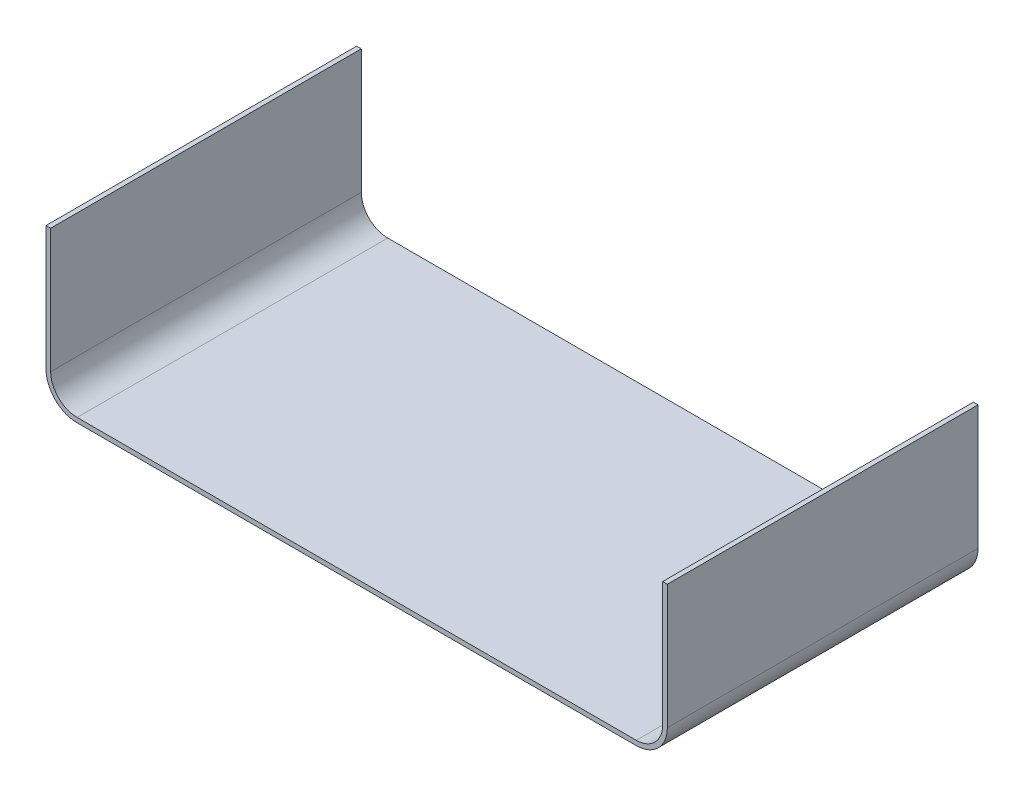
ISO-10303-21;
HEADER;
FILE_DESCRIPTION(('STEP AP214'),'2;1');
FILE_NAME('part.step','',(''),(''),'','','');
FILE_SCHEMA(('AUTOMOTIVE_DESIGN { 1 0 10303 214 1 1 1 1 }'));
ENDSEC;
DATA;
#1=APPLICATION_CONTEXT('core data for automotive mechanical design processes');
#2=APPLICATION_PROTOCOL_DEFINITION('international standard','automotive_design',2000,#1);
#3=PRODUCT_CONTEXT('',#1,'mechanical');
#4=PRODUCT('Part','Part','',(#3));
#5=PRODUCT_RELATED_PRODUCT_CATEGORY('part','',(#4));
#6=PRODUCT_DEFINITION_FORMATION('','',#4);
#7=PRODUCT_DEFINITION_CONTEXT('part definition',#1,'design');
#8=PRODUCT_DEFINITION('design','',#6,#7);
#9=PRODUCT_DEFINITION_SHAPE('','',#8);
#10=(LENGTH_UNIT() NAMED_UNIT(*) SI_UNIT(.MILLI.,.METRE.));
#11=(NAMED_UNIT(*) PLANE_ANGLE_UNIT() SI_UNIT($,.RADIAN.));
#12=(NAMED_UNIT(*) SI_UNIT($,.STERADIAN.) SOLID_ANGLE_UNIT());
#13=UNCERTAINTY_MEASURE_WITH_UNIT(LENGTH_MEASURE(1.E-05),#10,'distance_accuracy_value','');
#14=(GEOMETRIC_REPRESENTATION_CONTEXT(3) GLOBAL_UNCERTAINTY_ASSIGNED_CONTEXT((#13)) GLOBAL_UNIT_ASSIGNED_CONTEXT((#10,
#11,#12)) REPRESENTATION_CONTEXT('',''));
#15=CARTESIAN_POINT('',(0.,0.,0.));
#16=DIRECTION('',(0.,0.,1.));
#17=DIRECTION('',(1.,0.,0.));
#18=AXIS2_PLACEMENT_3D('',#15,#16,#17);
#19=CARTESIAN_POINT('',(-200.,100.,200.));
#20=DIRECTION('',(0.,-1.,0.));
#21=DIRECTION('',(0.,0.,-1.));
#22=AXIS2_PLACEMENT_3D('',#19,#20,#21);
#23=PLANE('',#22);
#24=DIRECTION('',(0.,0.,-1.));
#25=VECTOR('',#24,1.);
#26=CARTESIAN_POINT('',(197.,100.,200.));
#27=LINE('',#26,#25);
#28=CARTESIAN_POINT('',(197.,100.,200.));
#29=VERTEX_POINT('',#28);
#30=CARTESIAN_POINT('',(197.,100.,0.));
#31=VERTEX_POINT('',#30);
#32=EDGE_CURVE('E136',#29,#31,#27,.T.);
#33=ORIENTED_EDGE('',*,*,#32,.F.);
#34=DIRECTION('',(-1.,0.,0.));
#35=VECTOR('',#34,1.);
#36=CARTESIAN_POINT('',(-200.,100.,200.));
#37=LINE('',#36,#35);
#38=CARTESIAN_POINT('',(200.,100.,200.));
#39=VERTEX_POINT('',#38);
#40=EDGE_CURVE('E202',#39,#29,#37,.T.);
#41=ORIENTED_EDGE('',*,*,#40,.F.);
#42=DIRECTION('',(0.,0.,-1.));
#43=VECTOR('',#42,1.);
#44=CARTESIAN_POINT('',(200.,100.,200.));
#45=LINE('',#44,#43);
#46=CARTESIAN_POINT('',(200.,100.,0.));
#47=VERTEX_POINT('',#46);
#48=EDGE_CURVE('E157',#39,#47,#45,.T.);
#49=ORIENTED_EDGE('',*,*,#48,.T.);
#50=DIRECTION('',(-1.,0.,0.));
#51=VECTOR('',#50,1.);
#52=CARTESIAN_POINT('',(-200.,100.,0.));
#53=LINE('',#52,#51);
#54=EDGE_CURVE('E142',#47,#31,#53,.T.);
#55=ORIENTED_EDGE('',*,*,#54,.T.);
#56=EDGE_LOOP('',(#33,#41,#49,#55));
#57=FACE_BOUND('',#56,.T.);
#58=ADVANCED_FACE('F31',(#57),#23,.F.);
#59=CARTESIAN_POINT('',(-197.,100.,200.));
#60=VERTEX_POINT('',#59);
#61=CARTESIAN_POINT('',(-200.,100.,200.));
#62=VERTEX_POINT('',#61);
#63=EDGE_CURVE('E134',#60,#62,#37,.T.);
#64=ORIENTED_EDGE('',*,*,#63,.F.);
#65=DIRECTION('',(0.,0.,-1.));
#66=VECTOR('',#65,1.);
#67=CARTESIAN_POINT('',(-197.,100.,200.));
#68=LINE('',#67,#66);
#69=CARTESIAN_POINT('',(-197.,100.,0.));
#70=VERTEX_POINT('',#69);
#71=EDGE_CURVE('E121',#60,#70,#68,.T.);
#72=ORIENTED_EDGE('',*,*,#71,.T.);
#73=CARTESIAN_POINT('',(-200.,100.,0.));
#74=VERTEX_POINT('',#73);
#75=EDGE_CURVE('E132',#70,#74,#53,.T.);
#76=ORIENTED_EDGE('',*,*,#75,.T.);
#77=DIRECTION('',(0.,0.,-1.));
#78=VECTOR('',#77,1.);
#79=CARTESIAN_POINT('',(-200.,100.,200.));
#80=LINE('',#79,#78);
#81=EDGE_CURVE('E160',#62,#74,#80,.T.);
#82=ORIENTED_EDGE('',*,*,#81,.F.);
#83=EDGE_LOOP('',(#64,#72,#76,#82));
#84=FACE_BOUND('',#83,.T.);
#85=ADVANCED_FACE('F130',(#84),#23,.F.);
#86=CARTESIAN_POINT('',(-200.,100.,200.));
#87=DIRECTION('',(1.,0.,0.));
#88=DIRECTION('',(0.,1.,0.));
#89=AXIS2_PLACEMENT_3D('',#86,#87,#88);
#90=PLANE('',#89);
#91=DIRECTION('',(0.,-1.,0.));
#92=VECTOR('',#91,1.);
#93=CARTESIAN_POINT('',(-200.,100.,0.));
#94=LINE('',#93,#92);
#95=CARTESIAN_POINT('',(-200.,20.0000000000001,0.));
#96=VERTEX_POINT('',#95);
#97=EDGE_CURVE('E140',#74,#96,#94,.T.);
#98=ORIENTED_EDGE('',*,*,#97,.T.);
#99=DIRECTION('',(0.,0.,-1.));
#100=VECTOR('',#99,1.);
#101=CARTESIAN_POINT('',(-200.,20.0000000000001,200.));
#102=LINE('',#101,#100);
#103=CARTESIAN_POINT('',(-200.,20.0000000000001,200.));
#104=VERTEX_POINT('',#103);
#105=EDGE_CURVE('E11',#96,#104,#102,.F.);
#106=ORIENTED_EDGE('',*,*,#105,.T.);
#107=DIRECTION('',(0.,-1.,0.));
#108=VECTOR('',#107,1.);
#109=CARTESIAN_POINT('',(-200.,100.,200.));
#110=LINE('',#109,#108);
#111=EDGE_CURVE('E201',#62,#104,#110,.T.);
#112=ORIENTED_EDGE('',*,*,#111,.F.);
#113=ORIENTED_EDGE('',*,*,#81,.T.);
#114=EDGE_LOOP('',(#98,#106,#112,#113));
#115=FACE_BOUND('',#114,.T.);
#116=ADVANCED_FACE('F200',(#115),#90,.F.);
#117=CARTESIAN_POINT('',(-200.,0.,200.));
#118=DIRECTION('',(0.,1.,0.));
#119=DIRECTION('',(0.,0.,1.));
#120=AXIS2_PLACEMENT_3D('',#117,#118,#119);
#121=PLANE('',#120);
#122=DIRECTION('',(1.,0.,0.));
#123=VECTOR('',#122,1.);
#124=CARTESIAN_POINT('',(-200.,0.,0.));
#125=LINE('',#124,#123);
#126=CARTESIAN_POINT('',(-180.,0.,0.));
#127=VERTEX_POINT('',#126);
#128=CARTESIAN_POINT('',(180.,0.,0.));
#129=VERTEX_POINT('',#128);
#130=EDGE_CURVE('E152',#127,#129,#125,.T.);
#131=ORIENTED_EDGE('',*,*,#130,.T.);
#132=DIRECTION('',(0.,0.,-1.));
#133=VECTOR('',#132,1.);
#134=CARTESIAN_POINT('',(180.,0.,200.));
#135=LINE('',#134,#133);
#136=CARTESIAN_POINT('',(180.,0.,200.));
#137=VERTEX_POINT('',#136);
#138=EDGE_CURVE('E172',#129,#137,#135,.F.);
#139=ORIENTED_EDGE('',*,*,#138,.T.);
#140=DIRECTION('',(1.,0.,0.));
#141=VECTOR('',#140,1.);
#142=CARTESIAN_POINT('',(-200.,0.,200.));
#143=LINE('',#142,#141);
#144=CARTESIAN_POINT('',(-180.,0.,200.));
#145=VERTEX_POINT('',#144);
#146=EDGE_CURVE('E184',#145,#137,#143,.T.);
#147=ORIENTED_EDGE('',*,*,#146,.F.);
#148=DIRECTION('',(0.,0.,-1.));
#149=VECTOR('',#148,1.);
#150=CARTESIAN_POINT('',(-180.,0.,200.));
#151=LINE('',#150,#149);
#152=EDGE_CURVE('E169',#145,#127,#151,.T.);
#153=ORIENTED_EDGE('',*,*,#152,.T.);
#154=EDGE_LOOP('',(#131,#139,#147,#153));
#155=FACE_BOUND('',#154,.T.);
#156=ADVANCED_FACE('F196',(#155),#121,.F.);
#157=CARTESIAN_POINT('',(200.,0.,200.));
#158=DIRECTION('',(-1.,0.,0.));
#159=DIRECTION('',(0.,-1.,0.));
#160=AXIS2_PLACEMENT_3D('',#157,#158,#159);
#161=PLANE('',#160);
#162=DIRECTION('',(0.,1.,0.));
#163=VECTOR('',#162,1.);
#164=CARTESIAN_POINT('',(200.,0.,200.));
#165=LINE('',#164,#163);
#166=CARTESIAN_POINT('',(200.,20.0000000000001,200.));
#167=VERTEX_POINT('',#166);
#168=EDGE_CURVE('E149',#167,#39,#165,.T.);
#169=ORIENTED_EDGE('',*,*,#168,.F.);
#170=DIRECTION('',(0.,0.,-1.));
#171=VECTOR('',#170,1.);
#172=CARTESIAN_POINT('',(200.,20.0000000000001,200.));
#173=LINE('',#172,#171);
#174=CARTESIAN_POINT('',(200.,20.0000000000001,0.));
#175=VERTEX_POINT('',#174);
#176=EDGE_CURVE('E162',#167,#175,#173,.T.);
#177=ORIENTED_EDGE('',*,*,#176,.T.);
#178=DIRECTION('',(0.,1.,0.));
#179=VECTOR('',#178,1.);
#180=CARTESIAN_POINT('',(200.,0.,0.));
#181=LINE('',#180,#179);
#182=EDGE_CURVE('E155',#175,#47,#181,.T.);
#183=ORIENTED_EDGE('',*,*,#182,.T.);
#184=ORIENTED_EDGE('',*,*,#48,.F.);
#185=EDGE_LOOP('',(#169,#177,#183,#184));
#186=FACE_BOUND('',#185,.T.);
#187=ADVANCED_FACE('F189',(#186),#161,.F.);
#188=CARTESIAN_POINT('',(200.,100.,200.));
#189=DIRECTION('',(0.,0.,1.));
#190=DIRECTION('',(1.,0.,0.));
#191=AXIS2_PLACEMENT_3D('',#188,#189,#190);
#192=PLANE('',#191);
#193=DIRECTION('',(0.,1.,0.));
#194=VECTOR('',#193,1.);
#195=CARTESIAN_POINT('',(197.,0.,200.));
#196=LINE('',#195,#194);
#197=CARTESIAN_POINT('',(197.,20.0000000000001,200.));
#198=VERTEX_POINT('',#197);
#199=EDGE_CURVE('E218',#198,#29,#196,.T.);
#200=ORIENTED_EDGE('',*,*,#199,.F.);
#201=CARTESIAN_POINT('',(180.,20.,200.));
#202=DIRECTION('',(0.,0.,1.));
#203=DIRECTION('',(1.,0.,0.));
#204=AXIS2_PLACEMENT_3D('',#201,#202,#203);
#205=CIRCLE('',#204,17.);
#206=CARTESIAN_POINT('',(180.,3.,200.));
#207=VERTEX_POINT('',#206);
#208=EDGE_CURVE('E145',#207,#198,#205,.T.);
#209=ORIENTED_EDGE('',*,*,#208,.F.);
#210=DIRECTION('',(1.,0.,0.));
#211=VECTOR('',#210,1.);
#212=CARTESIAN_POINT('',(-200.,3.,200.));
#213=LINE('',#212,#211);
#214=CARTESIAN_POINT('',(-180.,3.,200.));
#215=VERTEX_POINT('',#214);
#216=EDGE_CURVE('E220',#215,#207,#213,.T.);
#217=ORIENTED_EDGE('',*,*,#216,.F.);
#218=CARTESIAN_POINT('',(-180.,20.,200.));
#219=DIRECTION('',(0.,0.,1.));
#220=DIRECTION('',(1.,0.,0.));
#221=AXIS2_PLACEMENT_3D('',#218,#219,#220);
#222=CIRCLE('',#221,17.);
#223=CARTESIAN_POINT('',(-197.,20.0000000000001,200.));
#224=VERTEX_POINT('',#223);
#225=EDGE_CURVE('E222',#224,#215,#222,.T.);
#226=ORIENTED_EDGE('',*,*,#225,.F.);
#227=DIRECTION('',(0.,-1.,0.));
#228=VECTOR('',#227,1.);
#229=CARTESIAN_POINT('',(-197.,100.,200.));
#230=LINE('',#229,#228);
#231=EDGE_CURVE('E216',#60,#224,#230,.T.);
#232=ORIENTED_EDGE('',*,*,#231,.F.);
#233=ORIENTED_EDGE('',*,*,#63,.T.);
#234=ORIENTED_EDGE('',*,*,#111,.T.);
#235=CARTESIAN_POINT('',(-180.,20.,200.));
#236=DIRECTION('',(0.,0.,1.));
#237=DIRECTION('',(1.,0.,0.));
#238=AXIS2_PLACEMENT_3D('',#235,#236,#237);
#239=CIRCLE('',#238,20.);
#240=EDGE_CURVE('E174',#104,#145,#239,.T.);
#241=ORIENTED_EDGE('',*,*,#240,.T.);
#242=ORIENTED_EDGE('',*,*,#146,.T.);
#243=CARTESIAN_POINT('',(180.,20.,200.));
#244=DIRECTION('',(0.,0.,1.));
#245=DIRECTION('',(1.,0.,0.));
#246=AXIS2_PLACEMENT_3D('',#243,#244,#245);
#247=CIRCLE('',#246,20.);
#248=EDGE_CURVE('E39',#137,#167,#247,.T.);
#249=ORIENTED_EDGE('',*,*,#248,.T.);
#250=ORIENTED_EDGE('',*,*,#168,.T.);
#251=ORIENTED_EDGE('',*,*,#40,.T.);
#252=EDGE_LOOP('',(#200,#209,#217,#226,#232,#233,#234,#241,#242,#249,#250,#251));
#253=FACE_BOUND('',#252,.T.);
#254=ADVANCED_FACE('F180',(#253),#192,.T.);
#255=CARTESIAN_POINT('',(200.,100.,0.));
#256=DIRECTION('',(0.,0.,1.));
#257=DIRECTION('',(1.,0.,0.));
#258=AXIS2_PLACEMENT_3D('',#255,#256,#257);
#259=PLANE('',#258);
#260=CARTESIAN_POINT('',(180.,20.,0.));
#261=DIRECTION('',(0.,0.,1.));
#262=DIRECTION('',(1.,0.,0.));
#263=AXIS2_PLACEMENT_3D('',#260,#261,#262);
#264=CIRCLE('',#263,17.);
#265=CARTESIAN_POINT('',(197.,20.0000000000001,0.));
#266=VERTEX_POINT('',#265);
#267=CARTESIAN_POINT('',(180.,3.,0.));
#268=VERTEX_POINT('',#267);
#269=EDGE_CURVE('E208',#266,#268,#264,.F.);
#270=ORIENTED_EDGE('',*,*,#269,.F.);
#271=DIRECTION('',(0.,1.,0.));
#272=VECTOR('',#271,1.);
#273=CARTESIAN_POINT('',(197.,0.,0.));
#274=LINE('',#273,#272);
#275=EDGE_CURVE('E211',#266,#31,#274,.T.);
#276=ORIENTED_EDGE('',*,*,#275,.T.);
#277=ORIENTED_EDGE('',*,*,#54,.F.);
#278=ORIENTED_EDGE('',*,*,#182,.F.);
#279=CARTESIAN_POINT('',(180.,20.,0.));
#280=DIRECTION('',(0.,0.,1.));
#281=DIRECTION('',(1.,0.,0.));
#282=AXIS2_PLACEMENT_3D('',#279,#280,#281);
#283=CIRCLE('',#282,20.);
#284=EDGE_CURVE('E167',#175,#129,#283,.F.);
#285=ORIENTED_EDGE('',*,*,#284,.T.);
#286=ORIENTED_EDGE('',*,*,#130,.F.);
#287=CARTESIAN_POINT('',(-180.,20.,0.));
#288=DIRECTION('',(0.,0.,1.));
#289=DIRECTION('',(1.,0.,0.));
#290=AXIS2_PLACEMENT_3D('',#287,#288,#289);
#291=CIRCLE('',#290,20.);
#292=EDGE_CURVE('E165',#127,#96,#291,.F.);
#293=ORIENTED_EDGE('',*,*,#292,.T.);
#294=ORIENTED_EDGE('',*,*,#97,.F.);
#295=ORIENTED_EDGE('',*,*,#75,.F.);
#296=DIRECTION('',(0.,-1.,0.));
#297=VECTOR('',#296,1.);
#298=CARTESIAN_POINT('',(-197.,100.,0.));
#299=LINE('',#298,#297);
#300=CARTESIAN_POINT('',(-197.,20.0000000000001,0.));
#301=VERTEX_POINT('',#300);
#302=EDGE_CURVE('E118',#70,#301,#299,.T.);
#303=ORIENTED_EDGE('',*,*,#302,.T.);
#304=CARTESIAN_POINT('',(-180.,20.,0.));
#305=DIRECTION('',(0.,0.,1.));
#306=DIRECTION('',(1.,0.,0.));
#307=AXIS2_PLACEMENT_3D('',#304,#305,#306);
#308=CIRCLE('',#307,17.);
#309=CARTESIAN_POINT('',(-180.,3.,0.));
#310=VERTEX_POINT('',#309);
#311=EDGE_CURVE('E206',#310,#301,#308,.F.);
#312=ORIENTED_EDGE('',*,*,#311,.F.);
#313=DIRECTION('',(1.,0.,0.));
#314=VECTOR('',#313,1.);
#315=CARTESIAN_POINT('',(-200.,3.,0.));
#316=LINE('',#315,#314);
#317=EDGE_CURVE('E126',#310,#268,#316,.T.);
#318=ORIENTED_EDGE('',*,*,#317,.T.);
#319=EDGE_LOOP('',(#270,#276,#277,#278,#285,#286,#293,#294,#295,#303,#312,#318));
#320=FACE_BOUND('',#319,.T.);
#321=ADVANCED_FACE('F139',(#320),#259,.F.);
#322=CARTESIAN_POINT('',(180.,20.,200.));
#323=DIRECTION('',(0.,0.,-1.));
#324=DIRECTION('',(-1.,0.,0.));
#325=AXIS2_PLACEMENT_3D('',#322,#323,#324);
#326=CYLINDRICAL_SURFACE('',#325,20.);
#327=ORIENTED_EDGE('',*,*,#248,.F.);
#328=ORIENTED_EDGE('',*,*,#138,.F.);
#329=ORIENTED_EDGE('',*,*,#284,.F.);
#330=ORIENTED_EDGE('',*,*,#176,.F.);
#331=EDGE_LOOP('',(#327,#328,#329,#330));
#332=FACE_BOUND('',#331,.T.);
#333=ADVANCED_FACE('F192',(#332),#326,.T.);
#334=CARTESIAN_POINT('',(-180.,20.,200.));
#335=DIRECTION('',(0.,0.,-1.));
#336=DIRECTION('',(-1.,0.,0.));
#337=AXIS2_PLACEMENT_3D('',#334,#335,#336);
#338=CYLINDRICAL_SURFACE('',#337,20.);
#339=ORIENTED_EDGE('',*,*,#240,.F.);
#340=ORIENTED_EDGE('',*,*,#105,.F.);
#341=ORIENTED_EDGE('',*,*,#292,.F.);
#342=ORIENTED_EDGE('',*,*,#152,.F.);
#343=EDGE_LOOP('',(#339,#340,#341,#342));
#344=FACE_BOUND('',#343,.T.);
#345=ADVANCED_FACE('F33',(#344),#338,.T.);
#346=CARTESIAN_POINT('',(-197.,100.,200.));
#347=DIRECTION('',(1.,0.,0.));
#348=DIRECTION('',(0.,1.,0.));
#349=AXIS2_PLACEMENT_3D('',#346,#347,#348);
#350=PLANE('',#349);
#351=ORIENTED_EDGE('',*,*,#302,.F.);
#352=ORIENTED_EDGE('',*,*,#71,.F.);
#353=ORIENTED_EDGE('',*,*,#231,.T.);
#354=DIRECTION('',(0.,0.,1.));
#355=VECTOR('',#354,1.);
#356=CARTESIAN_POINT('',(-197.,20.0000000000001,200.));
#357=LINE('',#356,#355);
#358=EDGE_CURVE('E46',#301,#224,#357,.T.);
#359=ORIENTED_EDGE('',*,*,#358,.F.);
#360=EDGE_LOOP('',(#351,#352,#353,#359));
#361=FACE_BOUND('',#360,.T.);
#362=ADVANCED_FACE('F120',(#361),#350,.T.);
#363=CARTESIAN_POINT('',(-200.,3.,200.));
#364=DIRECTION('',(0.,1.,0.));
#365=DIRECTION('',(0.,0.,1.));
#366=AXIS2_PLACEMENT_3D('',#363,#364,#365);
#367=PLANE('',#366);
#368=ORIENTED_EDGE('',*,*,#317,.F.);
#369=DIRECTION('',(0.,0.,1.));
#370=VECTOR('',#369,1.);
#371=CARTESIAN_POINT('',(-180.,3.,200.));
#372=LINE('',#371,#370);
#373=EDGE_CURVE('E213',#215,#310,#372,.F.);
#374=ORIENTED_EDGE('',*,*,#373,.F.);
#375=ORIENTED_EDGE('',*,*,#216,.T.);
#376=DIRECTION('',(0.,0.,1.));
#377=VECTOR('',#376,1.);
#378=CARTESIAN_POINT('',(180.,3.,200.));
#379=LINE('',#378,#377);
#380=EDGE_CURVE('E226',#268,#207,#379,.T.);
#381=ORIENTED_EDGE('',*,*,#380,.F.);
#382=EDGE_LOOP('',(#368,#374,#375,#381));
#383=FACE_BOUND('',#382,.T.);
#384=ADVANCED_FACE('F238',(#383),#367,.T.);
#385=CARTESIAN_POINT('',(197.,0.,200.));
#386=DIRECTION('',(-1.,0.,0.));
#387=DIRECTION('',(0.,-1.,0.));
#388=AXIS2_PLACEMENT_3D('',#385,#386,#387);
#389=PLANE('',#388);
#390=ORIENTED_EDGE('',*,*,#199,.T.);
#391=ORIENTED_EDGE('',*,*,#32,.T.);
#392=ORIENTED_EDGE('',*,*,#275,.F.);
#393=DIRECTION('',(0.,0.,1.));
#394=VECTOR('',#393,1.);
#395=CARTESIAN_POINT('',(197.,20.0000000000001,200.));
#396=LINE('',#395,#394);
#397=EDGE_CURVE('E135',#198,#266,#396,.F.);
#398=ORIENTED_EDGE('',*,*,#397,.F.);
#399=EDGE_LOOP('',(#390,#391,#392,#398));
#400=FACE_BOUND('',#399,.T.);
#401=ADVANCED_FACE('F245',(#400),#389,.T.);
#402=CARTESIAN_POINT('',(180.,20.,200.));
#403=DIRECTION('',(0.,0.,-1.));
#404=DIRECTION('',(-1.,0.,0.));
#405=AXIS2_PLACEMENT_3D('',#402,#403,#404);
#406=CYLINDRICAL_SURFACE('',#405,17.);
#407=ORIENTED_EDGE('',*,*,#208,.T.);
#408=ORIENTED_EDGE('',*,*,#397,.T.);
#409=ORIENTED_EDGE('',*,*,#269,.T.);
#410=ORIENTED_EDGE('',*,*,#380,.T.);
#411=EDGE_LOOP('',(#407,#408,#409,#410));
#412=FACE_BOUND('',#411,.T.);
#413=ADVANCED_FACE('F241',(#412),#406,.F.);
#414=CARTESIAN_POINT('',(-180.,20.,200.));
#415=DIRECTION('',(0.,0.,-1.));
#416=DIRECTION('',(-1.,0.,0.));
#417=AXIS2_PLACEMENT_3D('',#414,#415,#416);
#418=CYLINDRICAL_SURFACE('',#417,17.);
#419=ORIENTED_EDGE('',*,*,#225,.T.);
#420=ORIENTED_EDGE('',*,*,#373,.T.);
#421=ORIENTED_EDGE('',*,*,#311,.T.);
#422=ORIENTED_EDGE('',*,*,#358,.T.);
#423=EDGE_LOOP('',(#419,#420,#421,#422));
#424=FACE_BOUND('',#423,.T.);
#425=ADVANCED_FACE('F233',(#424),#418,.F.);
#426=CLOSED_SHELL('',(#58,#85,#116,#156,#187,#254,#321,#333,#345,#362,#384,#401,#413,#425));
#427=MANIFOLD_SOLID_BREP('B2',#426);
#428=ADVANCED_BREP_SHAPE_REPRESENTATION('',(#18,#427),#14);
#429=SHAPE_DEFINITION_REPRESENTATION(#9,#428);
ENDSEC;
END-ISO-10303-21;
